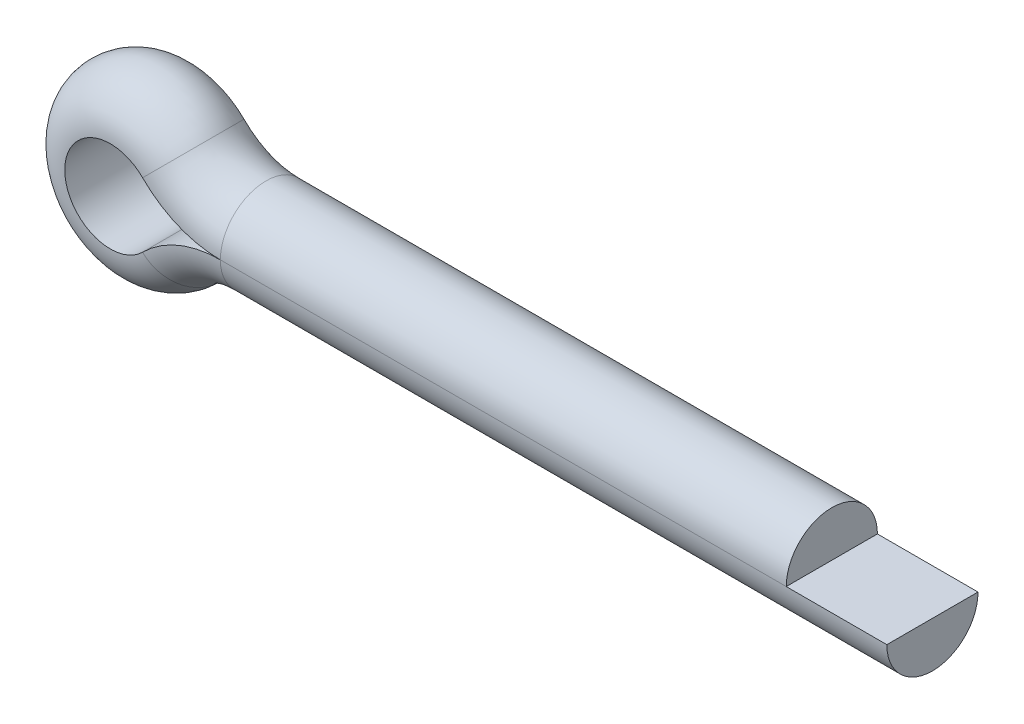
ISO-10303-21;
HEADER;
FILE_DESCRIPTION(('STEP AP214'),'2;1');
FILE_NAME('part.step','',(''),(''),'','','');
FILE_SCHEMA(('AUTOMOTIVE_DESIGN { 1 0 10303 214 1 1 1 1 }'));
ENDSEC;
DATA;
#1=APPLICATION_CONTEXT('core data for automotive mechanical design processes');
#2=APPLICATION_PROTOCOL_DEFINITION('international standard','automotive_design',2000,#1);
#3=PRODUCT_CONTEXT('',#1,'mechanical');
#4=PRODUCT('Part','Part','',(#3));
#5=PRODUCT_RELATED_PRODUCT_CATEGORY('part','',(#4));
#6=PRODUCT_DEFINITION_FORMATION('','',#4);
#7=PRODUCT_DEFINITION_CONTEXT('part definition',#1,'design');
#8=PRODUCT_DEFINITION('design','',#6,#7);
#9=PRODUCT_DEFINITION_SHAPE('','',#8);
#10=(LENGTH_UNIT() NAMED_UNIT(*) SI_UNIT(.MILLI.,.METRE.));
#11=(NAMED_UNIT(*) PLANE_ANGLE_UNIT() SI_UNIT($,.RADIAN.));
#12=(NAMED_UNIT(*) SI_UNIT($,.STERADIAN.) SOLID_ANGLE_UNIT());
#13=UNCERTAINTY_MEASURE_WITH_UNIT(LENGTH_MEASURE(1.E-05),#10,'distance_accuracy_value','');
#14=(GEOMETRIC_REPRESENTATION_CONTEXT(3) GLOBAL_UNCERTAINTY_ASSIGNED_CONTEXT((#13)) GLOBAL_UNIT_ASSIGNED_CONTEXT((#10,
#11,#12)) REPRESENTATION_CONTEXT('',''));
#15=CARTESIAN_POINT('',(0.,0.,0.));
#16=DIRECTION('',(0.,0.,1.));
#17=DIRECTION('',(1.,0.,0.));
#18=AXIS2_PLACEMENT_3D('',#15,#16,#17);
#19=CARTESIAN_POINT('',(6.40000000000002,0.,-1.45));
#20=DIRECTION('',(0.,-1.,0.));
#21=DIRECTION('',(1.,0.,0.));
#22=AXIS2_PLACEMENT_3D('',#19,#20,#21);
#23=PLANE('',#22);
#24=DIRECTION('',(0.,0.,-1.));
#25=VECTOR('',#24,1.);
#26=CARTESIAN_POINT('',(6.40000000000002,0.,-1.45));
#27=LINE('',#26,#25);
#28=CARTESIAN_POINT('',(6.40000000000002,0.,1.45));
#29=VERTEX_POINT('',#28);
#30=CARTESIAN_POINT('',(6.40000000000002,0.,-1.45));
#31=VERTEX_POINT('',#30);
#32=EDGE_CURVE('E147',#29,#31,#27,.T.);
#33=ORIENTED_EDGE('',*,*,#32,.F.);
#34=DIRECTION('',(1.,0.,0.));
#35=VECTOR('',#34,1.);
#36=CARTESIAN_POINT('',(6.40000000000002,0.,1.45));
#37=LINE('',#36,#35);
#38=CARTESIAN_POINT('',(27.6,0.,1.45));
#39=VERTEX_POINT('',#38);
#40=EDGE_CURVE('E46',#29,#39,#37,.T.);
#41=ORIENTED_EDGE('',*,*,#40,.T.);
#42=DIRECTION('',(0.,0.,-1.));
#43=VECTOR('',#42,1.);
#44=CARTESIAN_POINT('',(27.6,0.,-1.45));
#45=LINE('',#44,#43);
#46=CARTESIAN_POINT('',(27.6,0.,-1.45));
#47=VERTEX_POINT('',#46);
#48=EDGE_CURVE('E52',#39,#47,#45,.T.);
#49=ORIENTED_EDGE('',*,*,#48,.T.);
#50=DIRECTION('',(1.,0.,0.));
#51=VECTOR('',#50,1.);
#52=CARTESIAN_POINT('',(6.40000000000002,0.,-1.45));
#53=LINE('',#52,#51);
#54=EDGE_CURVE('E11',#31,#47,#53,.T.);
#55=ORIENTED_EDGE('',*,*,#54,.F.);
#56=EDGE_LOOP('',(#33,#41,#49,#55));
#57=FACE_BOUND('',#56,.T.);
#58=ADVANCED_FACE('F39',(#57),#23,.F.);
#59=CARTESIAN_POINT('',(6.40000000000002,0.,0.));
#60=DIRECTION('',(1.,0.,0.));
#61=DIRECTION('',(0.,1.,0.));
#62=AXIS2_PLACEMENT_3D('',#59,#60,#61);
#63=CYLINDRICAL_SURFACE('',#62,1.45);
#64=CARTESIAN_POINT('',(6.40000000000002,0.,0.));
#65=DIRECTION('',(-1.,0.,0.));
#66=DIRECTION('',(0.,0.,-1.));
#67=AXIS2_PLACEMENT_3D('',#64,#65,#66);
#68=CIRCLE('',#67,1.45);
#69=EDGE_CURVE('E141',#31,#29,#68,.T.);
#70=ORIENTED_EDGE('',*,*,#69,.F.);
#71=ORIENTED_EDGE('',*,*,#54,.T.);
#72=CARTESIAN_POINT('',(27.6,0.,0.));
#73=DIRECTION('',(-1.,0.,0.));
#74=DIRECTION('',(0.,0.,-1.));
#75=AXIS2_PLACEMENT_3D('',#72,#73,#74);
#76=CIRCLE('',#75,1.45);
#77=EDGE_CURVE('E56',#47,#39,#76,.T.);
#78=ORIENTED_EDGE('',*,*,#77,.T.);
#79=ORIENTED_EDGE('',*,*,#40,.F.);
#80=EDGE_LOOP('',(#70,#71,#78,#79));
#81=FACE_BOUND('',#80,.T.);
#82=ADVANCED_FACE('F158',(#81),#63,.T.);
#83=CARTESIAN_POINT('',(6.4,-3.49913793103448,0.));
#84=DIRECTION('',(0.,0.,-1.));
#85=DIRECTION('',(-1.,0.,0.));
#86=AXIS2_PLACEMENT_3D('',#83,#84,#85);
#87=CYLINDRICAL_SURFACE('',#86,3.49913793103448);
#88=DIRECTION('',(0.,0.,-1.));
#89=VECTOR('',#88,1.);
#90=CARTESIAN_POINT('',(3.92543110956281,-1.02517854032397,-1.45));
#91=LINE('',#90,#89);
#92=CARTESIAN_POINT('',(3.92543110956281,-1.02517854032397,1.45));
#93=VERTEX_POINT('',#92);
#94=CARTESIAN_POINT('',(3.92543110956281,-1.02517854032397,-1.45));
#95=VERTEX_POINT('',#94);
#96=EDGE_CURVE('E133',#93,#95,#91,.T.);
#97=ORIENTED_EDGE('',*,*,#96,.F.);
#98=CARTESIAN_POINT('',(6.4,-3.49913793103448,1.45));
#99=DIRECTION('',(0.,0.,-1.));
#100=DIRECTION('',(-1.,0.,0.));
#101=AXIS2_PLACEMENT_3D('',#98,#99,#100);
#102=CIRCLE('',#101,3.49913793103448);
#103=EDGE_CURVE('E146',#93,#29,#102,.T.);
#104=ORIENTED_EDGE('',*,*,#103,.T.);
#105=ORIENTED_EDGE('',*,*,#32,.T.);
#106=CARTESIAN_POINT('',(6.4,-3.49913793103448,-1.45));
#107=DIRECTION('',(0.,0.,-1.));
#108=DIRECTION('',(-1.,0.,0.));
#109=AXIS2_PLACEMENT_3D('',#106,#107,#108);
#110=CIRCLE('',#109,3.49913793103448);
#111=EDGE_CURVE('E152',#95,#31,#110,.T.);
#112=ORIENTED_EDGE('',*,*,#111,.F.);
#113=EDGE_LOOP('',(#97,#104,#105,#112));
#114=FACE_BOUND('',#113,.T.);
#115=ADVANCED_FACE('F162',(#114),#87,.T.);
#116=CARTESIAN_POINT('',(6.4,-3.49913793103448,0.));
#117=DIRECTION('',(0.,0.,-1.));
#118=DIRECTION('',(-1.,0.,0.));
#119=AXIS2_PLACEMENT_3D('',#116,#117,#118);
#120=TOROIDAL_SURFACE('',#119,3.49913793103448,1.45);
#121=CARTESIAN_POINT('',(3.92543110956281,-1.02517854032397,0.));
#122=DIRECTION('',(-0.707019682982048,-0.707193868664006,0.));
#123=DIRECTION('',(0.,0.,-1.));
#124=AXIS2_PLACEMENT_3D('',#121,#122,#123);
#125=CIRCLE('',#124,1.45);
#126=EDGE_CURVE('E131',#95,#93,#125,.T.);
#127=ORIENTED_EDGE('',*,*,#126,.F.);
#128=ORIENTED_EDGE('',*,*,#111,.T.);
#129=ORIENTED_EDGE('',*,*,#69,.T.);
#130=ORIENTED_EDGE('',*,*,#103,.F.);
#131=EDGE_LOOP('',(#127,#128,#129,#130));
#132=FACE_BOUND('',#131,.T.);
#133=ADVANCED_FACE('F165',(#132),#120,.T.);
#134=CARTESIAN_POINT('',(2.9,0.,0.));
#135=DIRECTION('',(0.,0.,1.));
#136=DIRECTION('',(1.,0.,0.));
#137=AXIS2_PLACEMENT_3D('',#134,#135,#136);
#138=CYLINDRICAL_SURFACE('',#137,1.45);
#139=DIRECTION('',(0.,0.,-1.));
#140=VECTOR('',#139,1.);
#141=CARTESIAN_POINT('',(3.92543110956279,1.02517854032399,-1.45));
#142=LINE('',#141,#140);
#143=CARTESIAN_POINT('',(3.92543110956279,1.02517854032399,1.45));
#144=VERTEX_POINT('',#143);
#145=CARTESIAN_POINT('',(3.92543110956279,1.02517854032399,-1.45));
#146=VERTEX_POINT('',#145);
#147=EDGE_CURVE('E101',#144,#146,#142,.T.);
#148=ORIENTED_EDGE('',*,*,#147,.F.);
#149=CARTESIAN_POINT('',(2.9,0.,1.45));
#150=DIRECTION('',(0.,0.,1.));
#151=DIRECTION('',(1.,0.,0.));
#152=AXIS2_PLACEMENT_3D('',#149,#150,#151);
#153=CIRCLE('',#152,1.45);
#154=EDGE_CURVE('E140',#144,#93,#153,.T.);
#155=ORIENTED_EDGE('',*,*,#154,.T.);
#156=ORIENTED_EDGE('',*,*,#96,.T.);
#157=CARTESIAN_POINT('',(2.9,0.,-1.45));
#158=DIRECTION('',(0.,0.,1.));
#159=DIRECTION('',(1.,0.,0.));
#160=AXIS2_PLACEMENT_3D('',#157,#158,#159);
#161=CIRCLE('',#160,1.45);
#162=EDGE_CURVE('E139',#146,#95,#161,.T.);
#163=ORIENTED_EDGE('',*,*,#162,.F.);
#164=EDGE_LOOP('',(#148,#155,#156,#163));
#165=FACE_BOUND('',#164,.T.);
#166=ADVANCED_FACE('F166',(#165),#138,.F.);
#167=CARTESIAN_POINT('',(2.9,0.,0.));
#168=DIRECTION('',(0.,0.,1.));
#169=DIRECTION('',(1.,0.,0.));
#170=AXIS2_PLACEMENT_3D('',#167,#168,#169);
#171=DEGENERATE_TOROIDAL_SURFACE('',#170,1.45,1.45,.T.);
#172=CARTESIAN_POINT('',(3.92543110956279,1.02517854032399,0.));
#173=DIRECTION('',(0.70701968298206,-0.707193868663995,0.));
#174=DIRECTION('',(0.,0.,-1.));
#175=AXIS2_PLACEMENT_3D('',#172,#173,#174);
#176=CIRCLE('',#175,1.45);
#177=EDGE_CURVE('E100',#146,#144,#176,.T.);
#178=ORIENTED_EDGE('',*,*,#177,.F.);
#179=ORIENTED_EDGE('',*,*,#162,.T.);
#180=ORIENTED_EDGE('',*,*,#126,.T.);
#181=ORIENTED_EDGE('',*,*,#154,.F.);
#182=EDGE_LOOP('',(#178,#179,#180,#181));
#183=FACE_BOUND('',#182,.T.);
#184=ADVANCED_FACE('F169',(#183),#171,.T.);
#185=CARTESIAN_POINT('',(6.4,3.49913793103449,0.));
#186=DIRECTION('',(0.,0.,-1.));
#187=DIRECTION('',(-1.,0.,0.));
#188=AXIS2_PLACEMENT_3D('',#185,#186,#187);
#189=CYLINDRICAL_SURFACE('',#188,3.49913793103449);
#190=DIRECTION('',(0.,0.,-1.));
#191=VECTOR('',#190,1.);
#192=CARTESIAN_POINT('',(6.4,0.,-1.45));
#193=LINE('',#192,#191);
#194=CARTESIAN_POINT('',(6.4,0.,1.45));
#195=VERTEX_POINT('',#194);
#196=CARTESIAN_POINT('',(6.4,0.,-1.45));
#197=VERTEX_POINT('',#196);
#198=EDGE_CURVE('E106',#195,#197,#193,.T.);
#199=ORIENTED_EDGE('',*,*,#198,.F.);
#200=CARTESIAN_POINT('',(6.4,3.49913793103449,1.45));
#201=DIRECTION('',(0.,0.,-1.));
#202=DIRECTION('',(-1.,0.,0.));
#203=AXIS2_PLACEMENT_3D('',#200,#201,#202);
#204=CIRCLE('',#203,3.49913793103449);
#205=EDGE_CURVE('E91',#195,#144,#204,.T.);
#206=ORIENTED_EDGE('',*,*,#205,.T.);
#207=ORIENTED_EDGE('',*,*,#147,.T.);
#208=CARTESIAN_POINT('',(6.4,3.49913793103449,-1.45));
#209=DIRECTION('',(0.,0.,-1.));
#210=DIRECTION('',(-1.,0.,0.));
#211=AXIS2_PLACEMENT_3D('',#208,#209,#210);
#212=CIRCLE('',#211,3.49913793103449);
#213=EDGE_CURVE('E105',#197,#146,#212,.T.);
#214=ORIENTED_EDGE('',*,*,#213,.F.);
#215=EDGE_LOOP('',(#199,#206,#207,#214));
#216=FACE_BOUND('',#215,.T.);
#217=ADVANCED_FACE('F108',(#216),#189,.T.);
#218=CARTESIAN_POINT('',(6.4,3.49913793103449,0.));
#219=DIRECTION('',(0.,0.,-1.));
#220=DIRECTION('',(-1.,0.,0.));
#221=AXIS2_PLACEMENT_3D('',#218,#219,#220);
#222=TOROIDAL_SURFACE('',#221,3.49913793103449,1.45);
#223=CARTESIAN_POINT('',(6.4,0.,0.));
#224=DIRECTION('',(1.,0.,0.));
#225=DIRECTION('',(0.,0.,-1.));
#226=AXIS2_PLACEMENT_3D('',#223,#224,#225);
#227=CIRCLE('',#226,1.45);
#228=EDGE_CURVE('E98',#197,#195,#227,.T.);
#229=ORIENTED_EDGE('',*,*,#228,.F.);
#230=ORIENTED_EDGE('',*,*,#213,.T.);
#231=ORIENTED_EDGE('',*,*,#177,.T.);
#232=ORIENTED_EDGE('',*,*,#205,.F.);
#233=EDGE_LOOP('',(#229,#230,#231,#232));
#234=FACE_BOUND('',#233,.T.);
#235=ADVANCED_FACE('F93',(#234),#222,.T.);
#236=CARTESIAN_POINT('',(6.4,0.,0.));
#237=DIRECTION('',(1.,0.,0.));
#238=DIRECTION('',(0.,1.,0.));
#239=AXIS2_PLACEMENT_3D('',#236,#237,#238);
#240=CYLINDRICAL_SURFACE('',#239,1.45);
#241=CARTESIAN_POINT('',(24.4,0.,0.));
#242=DIRECTION('',(1.,0.,0.));
#243=DIRECTION('',(0.,0.,-1.));
#244=AXIS2_PLACEMENT_3D('',#241,#242,#243);
#245=CIRCLE('',#244,1.45);
#246=CARTESIAN_POINT('',(24.4,0.,-1.45));
#247=VERTEX_POINT('',#246);
#248=CARTESIAN_POINT('',(24.4,0.,1.45));
#249=VERTEX_POINT('',#248);
#250=EDGE_CURVE('E124',#247,#249,#245,.T.);
#251=ORIENTED_EDGE('',*,*,#250,.F.);
#252=DIRECTION('',(1.,0.,0.));
#253=VECTOR('',#252,1.);
#254=CARTESIAN_POINT('',(6.4,0.,-1.45));
#255=LINE('',#254,#253);
#256=EDGE_CURVE('E118',#197,#247,#255,.T.);
#257=ORIENTED_EDGE('',*,*,#256,.F.);
#258=ORIENTED_EDGE('',*,*,#228,.T.);
#259=DIRECTION('',(1.,0.,0.));
#260=VECTOR('',#259,1.);
#261=CARTESIAN_POINT('',(6.4,0.,1.45));
#262=LINE('',#261,#260);
#263=EDGE_CURVE('E109',#195,#249,#262,.T.);
#264=ORIENTED_EDGE('',*,*,#263,.T.);
#265=EDGE_LOOP('',(#251,#257,#258,#264));
#266=FACE_BOUND('',#265,.T.);
#267=ADVANCED_FACE('F122',(#266),#240,.T.);
#268=CARTESIAN_POINT('',(6.4,0.,-1.45));
#269=DIRECTION('',(0.,-1.,0.));
#270=DIRECTION('',(1.,0.,0.));
#271=AXIS2_PLACEMENT_3D('',#268,#269,#270);
#272=PLANE('',#271);
#273=DIRECTION('',(0.,0.,-1.));
#274=VECTOR('',#273,1.);
#275=CARTESIAN_POINT('',(24.4,0.,-1.45));
#276=LINE('',#275,#274);
#277=EDGE_CURVE('E114',#249,#247,#276,.T.);
#278=ORIENTED_EDGE('',*,*,#277,.F.);
#279=ORIENTED_EDGE('',*,*,#263,.F.);
#280=ORIENTED_EDGE('',*,*,#198,.T.);
#281=ORIENTED_EDGE('',*,*,#256,.T.);
#282=EDGE_LOOP('',(#278,#279,#280,#281));
#283=FACE_BOUND('',#282,.T.);
#284=ADVANCED_FACE('F113',(#283),#272,.T.);
#285=CARTESIAN_POINT('',(27.6,0.,0.));
#286=DIRECTION('',(-1.,0.,0.));
#287=DIRECTION('',(0.,0.,-1.));
#288=AXIS2_PLACEMENT_3D('',#285,#286,#287);
#289=PLANE('',#288);
#290=ORIENTED_EDGE('',*,*,#77,.F.);
#291=ORIENTED_EDGE('',*,*,#48,.F.);
#292=EDGE_LOOP('',(#290,#291));
#293=FACE_BOUND('',#292,.T.);
#294=ADVANCED_FACE('F231',(#293),#289,.F.);
#295=CARTESIAN_POINT('',(24.4,0.,0.));
#296=DIRECTION('',(1.,0.,0.));
#297=DIRECTION('',(0.,0.,-1.));
#298=AXIS2_PLACEMENT_3D('',#295,#296,#297);
#299=PLANE('',#298);
#300=ORIENTED_EDGE('',*,*,#250,.T.);
#301=ORIENTED_EDGE('',*,*,#277,.T.);
#302=EDGE_LOOP('',(#300,#301));
#303=FACE_BOUND('',#302,.T.);
#304=ADVANCED_FACE('F245',(#303),#299,.T.);
#305=CLOSED_SHELL('',(#58,#82,#115,#133,#166,#184,#217,#235,#267,#284,#294,#304));
#306=MANIFOLD_SOLID_BREP('B2',#305);
#307=ADVANCED_BREP_SHAPE_REPRESENTATION('',(#18,#306),#14);
#308=SHAPE_DEFINITION_REPRESENTATION(#9,#307);
ENDSEC;
END-ISO-10303-21;
